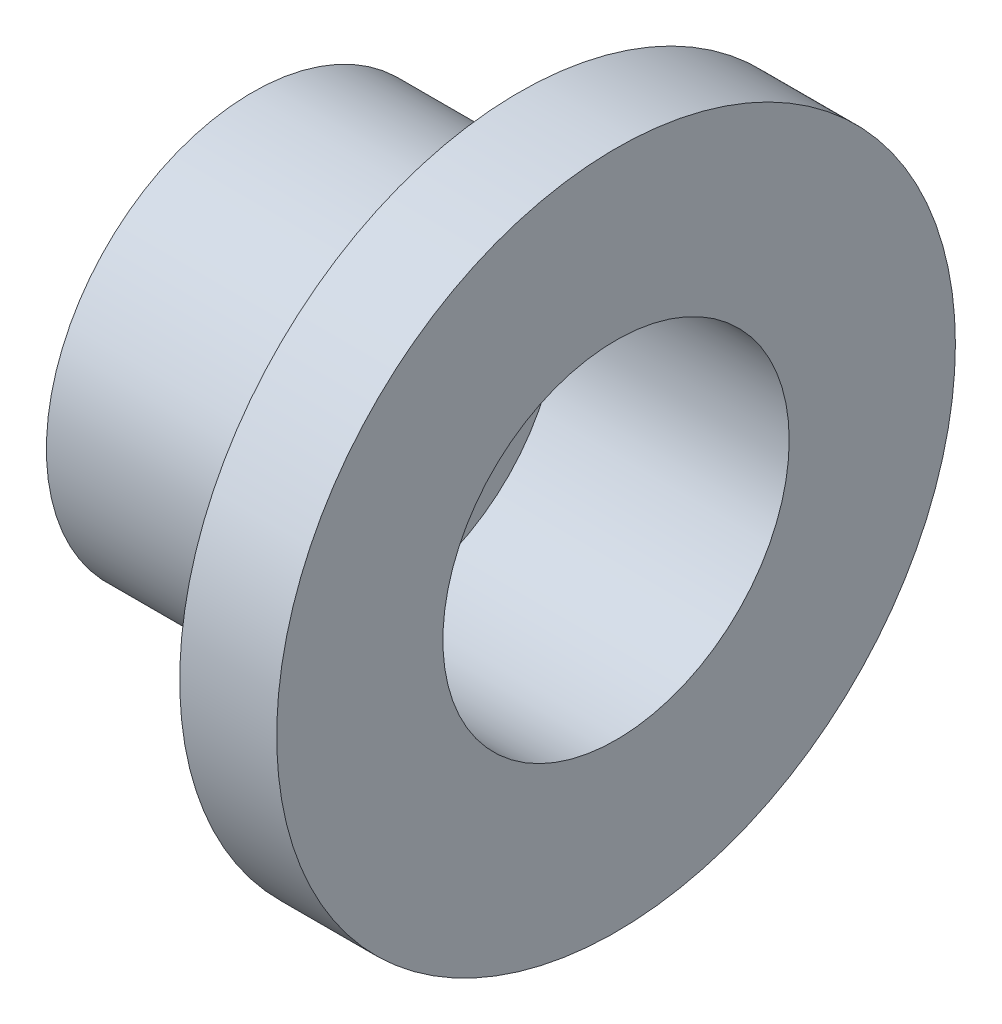
ISO-10303-21;
HEADER;
FILE_DESCRIPTION(('STEP AP214'),'2;1');
FILE_NAME('part.step','',(''),(''),'','','');
FILE_SCHEMA(('AUTOMOTIVE_DESIGN { 1 0 10303 214 1 1 1 1 }'));
ENDSEC;
DATA;
#1=APPLICATION_CONTEXT('core data for automotive mechanical design processes');
#2=APPLICATION_PROTOCOL_DEFINITION('international standard','automotive_design',2000,#1);
#3=PRODUCT_CONTEXT('',#1,'mechanical');
#4=PRODUCT('Part','Part','',(#3));
#5=PRODUCT_RELATED_PRODUCT_CATEGORY('part','',(#4));
#6=PRODUCT_DEFINITION_FORMATION('','',#4);
#7=PRODUCT_DEFINITION_CONTEXT('part definition',#1,'design');
#8=PRODUCT_DEFINITION('design','',#6,#7);
#9=PRODUCT_DEFINITION_SHAPE('','',#8);
#10=(LENGTH_UNIT() NAMED_UNIT(*) SI_UNIT(.MILLI.,.METRE.));
#11=(NAMED_UNIT(*) PLANE_ANGLE_UNIT() SI_UNIT($,.RADIAN.));
#12=(NAMED_UNIT(*) SI_UNIT($,.STERADIAN.) SOLID_ANGLE_UNIT());
#13=UNCERTAINTY_MEASURE_WITH_UNIT(LENGTH_MEASURE(1.E-05),#10,'distance_accuracy_value','');
#14=(GEOMETRIC_REPRESENTATION_CONTEXT(3) GLOBAL_UNCERTAINTY_ASSIGNED_CONTEXT((#13)) GLOBAL_UNIT_ASSIGNED_CONTEXT((#10,
#11,#12)) REPRESENTATION_CONTEXT('',''));
#15=CARTESIAN_POINT('',(0.,0.,0.));
#16=DIRECTION('',(0.,0.,1.));
#17=DIRECTION('',(1.,0.,0.));
#18=AXIS2_PLACEMENT_3D('',#15,#16,#17);
#19=CARTESIAN_POINT('',(0.,0.,0.));
#20=DIRECTION('',(-1.,0.,0.));
#21=DIRECTION('',(0.,0.,1.));
#22=AXIS2_PLACEMENT_3D('',#19,#20,#21);
#23=PLANE('',#22);
#24=CARTESIAN_POINT('',(0.,0.,0.));
#25=DIRECTION('',(-1.,0.,0.));
#26=DIRECTION('',(0.,0.,1.));
#27=AXIS2_PLACEMENT_3D('',#24,#25,#26);
#28=CIRCLE('',#27,3.26389999999994);
#29=CARTESIAN_POINT('',(0.,0.,3.26389999999994));
#30=VERTEX_POINT('',#29);
#31=EDGE_CURVE('E34',#30,#30,#28,.T.);
#32=ORIENTED_EDGE('',*,*,#31,.F.);
#33=EDGE_LOOP('',(#32));
#34=FACE_BOUND('',#33,.T.);
#35=CARTESIAN_POINT('',(0.,0.,0.));
#36=DIRECTION('',(1.,0.,0.));
#37=DIRECTION('',(0.,0.,-1.));
#38=AXIS2_PLACEMENT_3D('',#35,#36,#37);
#39=CIRCLE('',#38,8.5);
#40=CARTESIAN_POINT('',(0.,0.,-8.5));
#41=VERTEX_POINT('',#40);
#42=EDGE_CURVE('E10',#41,#41,#39,.T.);
#43=ORIENTED_EDGE('',*,*,#42,.F.);
#44=EDGE_LOOP('',(#43));
#45=FACE_BOUND('',#44,.T.);
#46=ADVANCED_FACE('F31',(#34,#45),#23,.T.);
#47=CARTESIAN_POINT('',(0.,0.,0.));
#48=DIRECTION('',(1.,0.,0.));
#49=DIRECTION('',(0.,0.,-1.));
#50=AXIS2_PLACEMENT_3D('',#47,#48,#49);
#51=CYLINDRICAL_SURFACE('',#50,8.5);
#52=ORIENTED_EDGE('',*,*,#42,.T.);
#53=EDGE_LOOP('',(#52));
#54=FACE_BOUND('',#53,.T.);
#55=CARTESIAN_POINT('',(11.,0.,0.));
#56=DIRECTION('',(1.,0.,0.));
#57=DIRECTION('',(0.,0.,-1.));
#58=AXIS2_PLACEMENT_3D('',#55,#56,#57);
#59=CIRCLE('',#58,8.5);
#60=CARTESIAN_POINT('',(11.,0.,-8.5));
#61=VERTEX_POINT('',#60);
#62=EDGE_CURVE('E38',#61,#61,#59,.T.);
#63=ORIENTED_EDGE('',*,*,#62,.F.);
#64=EDGE_LOOP('',(#63));
#65=FACE_BOUND('',#64,.T.);
#66=ADVANCED_FACE('F77',(#54,#65),#51,.T.);
#67=CARTESIAN_POINT('',(11.,8.5,0.));
#68=DIRECTION('',(-1.,0.,0.));
#69=DIRECTION('',(0.,0.,1.));
#70=AXIS2_PLACEMENT_3D('',#67,#68,#69);
#71=PLANE('',#70);
#72=ORIENTED_EDGE('',*,*,#62,.T.);
#73=EDGE_LOOP('',(#72));
#74=FACE_BOUND('',#73,.T.);
#75=CARTESIAN_POINT('',(11.,0.,0.));
#76=DIRECTION('',(1.,0.,0.));
#77=DIRECTION('',(0.,0.,-1.));
#78=AXIS2_PLACEMENT_3D('',#75,#76,#77);
#79=CIRCLE('',#78,14.);
#80=CARTESIAN_POINT('',(11.,0.,-14.));
#81=VERTEX_POINT('',#80);
#82=EDGE_CURVE('E42',#81,#81,#79,.T.);
#83=ORIENTED_EDGE('',*,*,#82,.F.);
#84=EDGE_LOOP('',(#83));
#85=FACE_BOUND('',#84,.T.);
#86=ADVANCED_FACE('F71',(#74,#85),#71,.T.);
#87=CARTESIAN_POINT('',(0.,0.,0.));
#88=DIRECTION('',(1.,0.,0.));
#89=DIRECTION('',(0.,0.,-1.));
#90=AXIS2_PLACEMENT_3D('',#87,#88,#89);
#91=CYLINDRICAL_SURFACE('',#90,14.);
#92=ORIENTED_EDGE('',*,*,#82,.T.);
#93=EDGE_LOOP('',(#92));
#94=FACE_BOUND('',#93,.T.);
#95=CARTESIAN_POINT('',(15.,0.,0.));
#96=DIRECTION('',(1.,0.,0.));
#97=DIRECTION('',(0.,0.,-1.));
#98=AXIS2_PLACEMENT_3D('',#95,#96,#97);
#99=CIRCLE('',#98,14.);
#100=CARTESIAN_POINT('',(15.,0.,-14.));
#101=VERTEX_POINT('',#100);
#102=EDGE_CURVE('E47',#101,#101,#99,.T.);
#103=ORIENTED_EDGE('',*,*,#102,.F.);
#104=EDGE_LOOP('',(#103));
#105=FACE_BOUND('',#104,.T.);
#106=ADVANCED_FACE('F66',(#94,#105),#91,.T.);
#107=CARTESIAN_POINT('',(15.,14.,0.));
#108=DIRECTION('',(1.,0.,0.));
#109=DIRECTION('',(0.,0.,-1.));
#110=AXIS2_PLACEMENT_3D('',#107,#108,#109);
#111=PLANE('',#110);
#112=CARTESIAN_POINT('',(15.,0.,0.));
#113=DIRECTION('',(1.,0.,0.));
#114=DIRECTION('',(0.,0.,-1.));
#115=AXIS2_PLACEMENT_3D('',#112,#113,#114);
#116=CIRCLE('',#115,7.14374999999999);
#117=CARTESIAN_POINT('',(15.,0.,-7.14374999999999));
#118=VERTEX_POINT('',#117);
#119=EDGE_CURVE('E56',#118,#118,#116,.T.);
#120=ORIENTED_EDGE('',*,*,#119,.F.);
#121=EDGE_LOOP('',(#120));
#122=FACE_BOUND('',#121,.T.);
#123=ORIENTED_EDGE('',*,*,#102,.T.);
#124=EDGE_LOOP('',(#123));
#125=FACE_BOUND('',#124,.T.);
#126=ADVANCED_FACE('F62',(#122,#125),#111,.T.);
#127=CARTESIAN_POINT('',(15.,0.,0.));
#128=DIRECTION('',(1.,0.,0.));
#129=DIRECTION('',(0.,0.,-1.));
#130=AXIS2_PLACEMENT_3D('',#127,#128,#129);
#131=CYLINDRICAL_SURFACE('',#130,3.26389999999994);
#132=ORIENTED_EDGE('',*,*,#31,.T.);
#133=EDGE_LOOP('',(#132));
#134=FACE_BOUND('',#133,.T.);
#135=CARTESIAN_POINT('',(5.475,0.,0.));
#136=DIRECTION('',(1.,0.,0.));
#137=DIRECTION('',(0.,0.,-1.));
#138=AXIS2_PLACEMENT_3D('',#135,#136,#137);
#139=CIRCLE('',#138,3.26389999999996);
#140=CARTESIAN_POINT('',(5.475,0.,-3.26389999999996));
#141=VERTEX_POINT('',#140);
#142=EDGE_CURVE('E50',#141,#141,#139,.T.);
#143=ORIENTED_EDGE('',*,*,#142,.T.);
#144=EDGE_LOOP('',(#143));
#145=FACE_BOUND('',#144,.T.);
#146=ADVANCED_FACE('F65',(#134,#145),#131,.F.);
#147=CARTESIAN_POINT('',(5.475,3.26389999999996,0.));
#148=DIRECTION('',(-1.,0.,0.));
#149=DIRECTION('',(0.,0.,1.));
#150=AXIS2_PLACEMENT_3D('',#147,#148,#149);
#151=PLANE('',#150);
#152=ORIENTED_EDGE('',*,*,#142,.F.);
#153=EDGE_LOOP('',(#152));
#154=FACE_BOUND('',#153,.T.);
#155=CARTESIAN_POINT('',(5.475,0.,0.));
#156=DIRECTION('',(1.,0.,0.));
#157=DIRECTION('',(0.,0.,-1.));
#158=AXIS2_PLACEMENT_3D('',#155,#156,#157);
#159=CIRCLE('',#158,7.14375);
#160=CARTESIAN_POINT('',(5.475,0.,-7.14375));
#161=VERTEX_POINT('',#160);
#162=EDGE_CURVE('E53',#161,#161,#159,.T.);
#163=ORIENTED_EDGE('',*,*,#162,.T.);
#164=EDGE_LOOP('',(#163));
#165=FACE_BOUND('',#164,.T.);
#166=ADVANCED_FACE('F91',(#154,#165),#151,.F.);
#167=CARTESIAN_POINT('',(15.,0.,0.));
#168=DIRECTION('',(1.,0.,0.));
#169=DIRECTION('',(0.,0.,-1.));
#170=AXIS2_PLACEMENT_3D('',#167,#168,#169);
#171=CYLINDRICAL_SURFACE('',#170,7.14375);
#172=ORIENTED_EDGE('',*,*,#162,.F.);
#173=EDGE_LOOP('',(#172));
#174=FACE_BOUND('',#173,.T.);
#175=ORIENTED_EDGE('',*,*,#119,.T.);
#176=EDGE_LOOP('',(#175));
#177=FACE_BOUND('',#176,.T.);
#178=ADVANCED_FACE('F60',(#174,#177),#171,.F.);
#179=CLOSED_SHELL('',(#46,#66,#86,#106,#126,#146,#166,#178));
#180=MANIFOLD_SOLID_BREP('B2',#179);
#181=ADVANCED_BREP_SHAPE_REPRESENTATION('',(#18,#180),#14);
#182=SHAPE_DEFINITION_REPRESENTATION(#9,#181);
ENDSEC;
END-ISO-10303-21;
